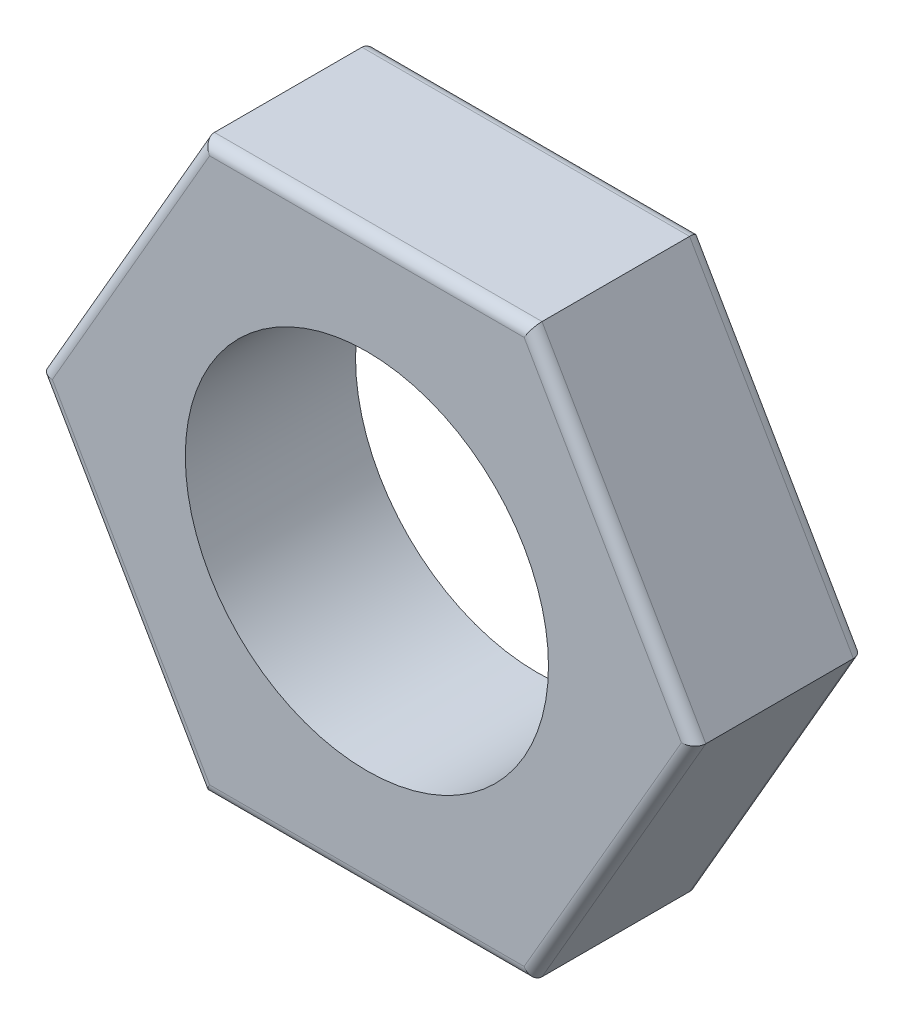
ISO-10303-21;
HEADER;
FILE_DESCRIPTION(('STEP AP214'),'2;1');
FILE_NAME('part.step','',(''),(''),'','','');
FILE_SCHEMA(('AUTOMOTIVE_DESIGN { 1 0 10303 214 1 1 1 1 }'));
ENDSEC;
DATA;
#1=APPLICATION_CONTEXT('core data for automotive mechanical design processes');
#2=APPLICATION_PROTOCOL_DEFINITION('international standard','automotive_design',2000,#1);
#3=PRODUCT_CONTEXT('',#1,'mechanical');
#4=PRODUCT('Part','Part','',(#3));
#5=PRODUCT_RELATED_PRODUCT_CATEGORY('part','',(#4));
#6=PRODUCT_DEFINITION_FORMATION('','',#4);
#7=PRODUCT_DEFINITION_CONTEXT('part definition',#1,'design');
#8=PRODUCT_DEFINITION('design','',#6,#7);
#9=PRODUCT_DEFINITION_SHAPE('','',#8);
#10=(LENGTH_UNIT() NAMED_UNIT(*) SI_UNIT(.MILLI.,.METRE.));
#11=(NAMED_UNIT(*) PLANE_ANGLE_UNIT() SI_UNIT($,.RADIAN.));
#12=(NAMED_UNIT(*) SI_UNIT($,.STERADIAN.) SOLID_ANGLE_UNIT());
#13=UNCERTAINTY_MEASURE_WITH_UNIT(LENGTH_MEASURE(1.E-05),#10,'distance_accuracy_value','');
#14=(GEOMETRIC_REPRESENTATION_CONTEXT(3) GLOBAL_UNCERTAINTY_ASSIGNED_CONTEXT((#13)) GLOBAL_UNIT_ASSIGNED_CONTEXT((#10,
#11,#12)) REPRESENTATION_CONTEXT('',''));
#15=CARTESIAN_POINT('',(0.,0.,0.));
#16=DIRECTION('',(0.,0.,1.));
#17=DIRECTION('',(1.,0.,0.));
#18=AXIS2_PLACEMENT_3D('',#15,#16,#17);
#19=CARTESIAN_POINT('',(-7.21687836487031,-12.5,7.5));
#20=DIRECTION('',(0.,1.,0.));
#21=DIRECTION('',(0.,0.,1.));
#22=AXIS2_PLACEMENT_3D('',#19,#20,#21);
#23=PLANE('',#22);
#24=DIRECTION('',(0.,0.,-1.));
#25=VECTOR('',#24,1.);
#26=CARTESIAN_POINT('',(-7.21687836487031,-12.5,7.5));
#27=LINE('',#26,#25);
#28=CARTESIAN_POINT('',(-7.21687836487031,-12.5,7.));
#29=VERTEX_POINT('',#28);
#30=CARTESIAN_POINT('',(-7.21687836487031,-12.5,0.5));
#31=VERTEX_POINT('',#30);
#32=EDGE_CURVE('E131',#29,#31,#27,.T.);
#33=ORIENTED_EDGE('',*,*,#32,.T.);
#34=DIRECTION('',(1.,0.,0.));
#35=VECTOR('',#34,1.);
#36=CARTESIAN_POINT('',(-7.21687836487031,-12.5,0.5));
#37=LINE('',#36,#35);
#38=CARTESIAN_POINT('',(7.21687836487031,-12.5,0.5));
#39=VERTEX_POINT('',#38);
#40=EDGE_CURVE('E249',#31,#39,#37,.T.);
#41=ORIENTED_EDGE('',*,*,#40,.T.);
#42=DIRECTION('',(0.,0.,-1.));
#43=VECTOR('',#42,1.);
#44=CARTESIAN_POINT('',(7.21687836487031,-12.5,7.5));
#45=LINE('',#44,#43);
#46=CARTESIAN_POINT('',(7.21687836487031,-12.5,7.));
#47=VERTEX_POINT('',#46);
#48=EDGE_CURVE('E153',#47,#39,#45,.T.);
#49=ORIENTED_EDGE('',*,*,#48,.F.);
#50=DIRECTION('',(1.,0.,0.));
#51=VECTOR('',#50,1.);
#52=CARTESIAN_POINT('',(-7.21687836487031,-12.5,7.));
#53=LINE('',#52,#51);
#54=EDGE_CURVE('E247',#47,#29,#53,.F.);
#55=ORIENTED_EDGE('',*,*,#54,.T.);
#56=EDGE_LOOP('',(#33,#41,#49,#55));
#57=FACE_BOUND('',#56,.T.);
#58=ADVANCED_FACE('F34',(#57),#23,.F.);
#59=CARTESIAN_POINT('',(7.21687836487031,-12.5,7.5));
#60=DIRECTION('',(-0.866025403784438,0.5,0.));
#61=DIRECTION('',(-0.5,-0.866025403784439,0.));
#62=AXIS2_PLACEMENT_3D('',#59,#60,#61);
#63=PLANE('',#62);
#64=ORIENTED_EDGE('',*,*,#48,.T.);
#65=DIRECTION('',(0.5,0.866025403784439,0.));
#66=VECTOR('',#65,1.);
#67=CARTESIAN_POINT('',(7.21687836487031,-12.5,0.5));
#68=LINE('',#67,#66);
#69=CARTESIAN_POINT('',(14.4337567297406,0.,0.5));
#70=VERTEX_POINT('',#69);
#71=EDGE_CURVE('E136',#39,#70,#68,.T.);
#72=ORIENTED_EDGE('',*,*,#71,.T.);
#73=DIRECTION('',(0.,0.,-1.));
#74=VECTOR('',#73,1.);
#75=CARTESIAN_POINT('',(14.4337567297406,0.,7.5));
#76=LINE('',#75,#74);
#77=CARTESIAN_POINT('',(14.4337567297406,0.,7.));
#78=VERTEX_POINT('',#77);
#79=EDGE_CURVE('E216',#78,#70,#76,.T.);
#80=ORIENTED_EDGE('',*,*,#79,.F.);
#81=DIRECTION('',(0.5,0.866025403784439,0.));
#82=VECTOR('',#81,1.);
#83=CARTESIAN_POINT('',(7.21687836487031,-12.5,7.));
#84=LINE('',#83,#82);
#85=EDGE_CURVE('E243',#78,#47,#84,.F.);
#86=ORIENTED_EDGE('',*,*,#85,.T.);
#87=EDGE_LOOP('',(#64,#72,#80,#86));
#88=FACE_BOUND('',#87,.T.);
#89=ADVANCED_FACE('F282',(#88),#63,.F.);
#90=CARTESIAN_POINT('',(14.4337567297406,0.,7.5));
#91=DIRECTION('',(-0.866025403784438,-0.5,0.));
#92=DIRECTION('',(0.5,-0.866025403784438,0.));
#93=AXIS2_PLACEMENT_3D('',#90,#91,#92);
#94=PLANE('',#93);
#95=ORIENTED_EDGE('',*,*,#79,.T.);
#96=DIRECTION('',(-0.5,0.866025403784438,0.));
#97=VECTOR('',#96,1.);
#98=CARTESIAN_POINT('',(14.4337567297406,0.,0.5));
#99=LINE('',#98,#97);
#100=CARTESIAN_POINT('',(7.21687836487031,12.5,0.5));
#101=VERTEX_POINT('',#100);
#102=EDGE_CURVE('E241',#70,#101,#99,.T.);
#103=ORIENTED_EDGE('',*,*,#102,.T.);
#104=DIRECTION('',(0.,0.,-1.));
#105=VECTOR('',#104,1.);
#106=CARTESIAN_POINT('',(7.21687836487031,12.5,7.5));
#107=LINE('',#106,#105);
#108=CARTESIAN_POINT('',(7.21687836487031,12.5,7.));
#109=VERTEX_POINT('',#108);
#110=EDGE_CURVE('E213',#109,#101,#107,.T.);
#111=ORIENTED_EDGE('',*,*,#110,.F.);
#112=DIRECTION('',(-0.5,0.866025403784438,0.));
#113=VECTOR('',#112,1.);
#114=CARTESIAN_POINT('',(14.4337567297406,0.,7.));
#115=LINE('',#114,#113);
#116=EDGE_CURVE('E239',#109,#78,#115,.F.);
#117=ORIENTED_EDGE('',*,*,#116,.T.);
#118=EDGE_LOOP('',(#95,#103,#111,#117));
#119=FACE_BOUND('',#118,.T.);
#120=ADVANCED_FACE('F269',(#119),#94,.F.);
#121=CARTESIAN_POINT('',(7.21687836487031,12.5,7.5));
#122=DIRECTION('',(0.,-1.,0.));
#123=DIRECTION('',(0.,0.,-1.));
#124=AXIS2_PLACEMENT_3D('',#121,#122,#123);
#125=PLANE('',#124);
#126=ORIENTED_EDGE('',*,*,#110,.T.);
#127=DIRECTION('',(-1.,0.,0.));
#128=VECTOR('',#127,1.);
#129=CARTESIAN_POINT('',(7.21687836487031,12.5,0.5));
#130=LINE('',#129,#128);
#131=CARTESIAN_POINT('',(-7.21687836487031,12.5,0.5));
#132=VERTEX_POINT('',#131);
#133=EDGE_CURVE('E237',#101,#132,#130,.T.);
#134=ORIENTED_EDGE('',*,*,#133,.T.);
#135=DIRECTION('',(0.,0.,-1.));
#136=VECTOR('',#135,1.);
#137=CARTESIAN_POINT('',(-7.21687836487031,12.5,7.5));
#138=LINE('',#137,#136);
#139=CARTESIAN_POINT('',(-7.21687836487031,12.5,7.));
#140=VERTEX_POINT('',#139);
#141=EDGE_CURVE('E147',#140,#132,#138,.T.);
#142=ORIENTED_EDGE('',*,*,#141,.F.);
#143=DIRECTION('',(-1.,0.,0.));
#144=VECTOR('',#143,1.);
#145=CARTESIAN_POINT('',(7.21687836487031,12.5,7.));
#146=LINE('',#145,#144);
#147=EDGE_CURVE('E235',#140,#109,#146,.F.);
#148=ORIENTED_EDGE('',*,*,#147,.T.);
#149=EDGE_LOOP('',(#126,#134,#142,#148));
#150=FACE_BOUND('',#149,.T.);
#151=ADVANCED_FACE('F266',(#150),#125,.F.);
#152=CARTESIAN_POINT('',(-7.21687836487031,12.5,7.5));
#153=DIRECTION('',(0.866025403784438,-0.5,0.));
#154=DIRECTION('',(0.5,0.866025403784438,0.));
#155=AXIS2_PLACEMENT_3D('',#152,#153,#154);
#156=PLANE('',#155);
#157=ORIENTED_EDGE('',*,*,#141,.T.);
#158=DIRECTION('',(-0.5,-0.866025403784438,0.));
#159=VECTOR('',#158,1.);
#160=CARTESIAN_POINT('',(-7.21687836487031,12.5,0.5));
#161=LINE('',#160,#159);
#162=CARTESIAN_POINT('',(-14.4337567297406,0.,0.5));
#163=VERTEX_POINT('',#162);
#164=EDGE_CURVE('E146',#132,#163,#161,.T.);
#165=ORIENTED_EDGE('',*,*,#164,.T.);
#166=DIRECTION('',(0.,0.,-1.));
#167=VECTOR('',#166,1.);
#168=CARTESIAN_POINT('',(-14.4337567297406,0.,7.5));
#169=LINE('',#168,#167);
#170=CARTESIAN_POINT('',(-14.4337567297406,0.,7.));
#171=VERTEX_POINT('',#170);
#172=EDGE_CURVE('E129',#171,#163,#169,.T.);
#173=ORIENTED_EDGE('',*,*,#172,.F.);
#174=DIRECTION('',(-0.5,-0.866025403784438,0.));
#175=VECTOR('',#174,1.);
#176=CARTESIAN_POINT('',(-7.21687836487031,12.5,7.));
#177=LINE('',#176,#175);
#178=EDGE_CURVE('E143',#171,#140,#177,.F.);
#179=ORIENTED_EDGE('',*,*,#178,.T.);
#180=EDGE_LOOP('',(#157,#165,#173,#179));
#181=FACE_BOUND('',#180,.T.);
#182=ADVANCED_FACE('F142',(#181),#156,.F.);
#183=CARTESIAN_POINT('',(-14.4337567297406,0.,7.5));
#184=DIRECTION('',(0.866025403784438,0.5,0.));
#185=DIRECTION('',(-0.5,0.866025403784439,0.));
#186=AXIS2_PLACEMENT_3D('',#183,#184,#185);
#187=PLANE('',#186);
#188=ORIENTED_EDGE('',*,*,#172,.T.);
#189=DIRECTION('',(0.5,-0.866025403784439,0.));
#190=VECTOR('',#189,1.);
#191=CARTESIAN_POINT('',(-14.4337567297406,0.,0.5));
#192=LINE('',#191,#190);
#193=EDGE_CURVE('E135',#163,#31,#192,.T.);
#194=ORIENTED_EDGE('',*,*,#193,.T.);
#195=ORIENTED_EDGE('',*,*,#32,.F.);
#196=DIRECTION('',(0.5,-0.866025403784439,0.));
#197=VECTOR('',#196,1.);
#198=CARTESIAN_POINT('',(-14.4337567297406,0.,7.));
#199=LINE('',#198,#197);
#200=EDGE_CURVE('E126',#29,#171,#199,.F.);
#201=ORIENTED_EDGE('',*,*,#200,.T.);
#202=EDGE_LOOP('',(#188,#194,#195,#201));
#203=FACE_BOUND('',#202,.T.);
#204=ADVANCED_FACE('F128',(#203),#187,.F.);
#205=CARTESIAN_POINT('',(0.,0.,7.5));
#206=DIRECTION('',(0.,0.,1.));
#207=DIRECTION('',(1.,0.,0.));
#208=AXIS2_PLACEMENT_3D('',#205,#206,#207);
#209=PLANE('',#208);
#210=DIRECTION('',(-0.5,-0.866025403784438,0.));
#211=VECTOR('',#210,1.);
#212=CARTESIAN_POINT('',(-14.0007440278484,-0.249999999999996,7.5));
#213=LINE('',#212,#211);
#214=CARTESIAN_POINT('',(-6.92820323027549,12.,7.5));
#215=VERTEX_POINT('',#214);
#216=CARTESIAN_POINT('',(-13.856406460551,0.,7.5));
#217=VERTEX_POINT('',#216);
#218=EDGE_CURVE('E43',#215,#217,#213,.T.);
#219=ORIENTED_EDGE('',*,*,#218,.T.);
#220=DIRECTION('',(0.5,-0.866025403784439,0.));
#221=VECTOR('',#220,1.);
#222=CARTESIAN_POINT('',(-6.78386566297809,-12.25,7.5));
#223=LINE('',#222,#221);
#224=CARTESIAN_POINT('',(-6.9282032302755,-12.,7.5));
#225=VERTEX_POINT('',#224);
#226=EDGE_CURVE('E11',#217,#225,#223,.T.);
#227=ORIENTED_EDGE('',*,*,#226,.T.);
#228=DIRECTION('',(1.,0.,0.));
#229=VECTOR('',#228,1.);
#230=CARTESIAN_POINT('',(7.21687836487031,-12.,7.5));
#231=LINE('',#230,#229);
#232=CARTESIAN_POINT('',(6.9282032302755,-12.,7.5));
#233=VERTEX_POINT('',#232);
#234=EDGE_CURVE('E257',#225,#233,#231,.T.);
#235=ORIENTED_EDGE('',*,*,#234,.T.);
#236=DIRECTION('',(0.5,0.866025403784439,0.));
#237=VECTOR('',#236,1.);
#238=CARTESIAN_POINT('',(14.0007440278484,0.250000000000005,7.5));
#239=LINE('',#238,#237);
#240=CARTESIAN_POINT('',(13.856406460551,0.,7.5));
#241=VERTEX_POINT('',#240);
#242=EDGE_CURVE('E255',#233,#241,#239,.T.);
#243=ORIENTED_EDGE('',*,*,#242,.T.);
#244=DIRECTION('',(-0.5,0.866025403784438,0.));
#245=VECTOR('',#244,1.);
#246=CARTESIAN_POINT('',(6.78386566297809,12.25,7.5));
#247=LINE('',#246,#245);
#248=CARTESIAN_POINT('',(6.92820323027549,12.,7.5));
#249=VERTEX_POINT('',#248);
#250=EDGE_CURVE('E253',#241,#249,#247,.T.);
#251=ORIENTED_EDGE('',*,*,#250,.T.);
#252=DIRECTION('',(-1.,0.,0.));
#253=VECTOR('',#252,1.);
#254=CARTESIAN_POINT('',(-7.21687836487031,12.,7.5));
#255=LINE('',#254,#253);
#256=EDGE_CURVE('E251',#249,#215,#255,.T.);
#257=ORIENTED_EDGE('',*,*,#256,.T.);
#258=EDGE_LOOP('',(#219,#227,#235,#243,#251,#257));
#259=FACE_BOUND('',#258,.T.);
#260=CARTESIAN_POINT('',(0.,0.,7.5));
#261=DIRECTION('',(0.,0.,1.));
#262=DIRECTION('',(1.,0.,0.));
#263=AXIS2_PLACEMENT_3D('',#260,#261,#262);
#264=CIRCLE('',#263,8.);
#265=CARTESIAN_POINT('',(8.,0.,7.5));
#266=VERTEX_POINT('',#265);
#267=EDGE_CURVE('E198',#266,#266,#264,.T.);
#268=ORIENTED_EDGE('',*,*,#267,.F.);
#269=EDGE_LOOP('',(#268));
#270=FACE_BOUND('',#269,.T.);
#271=ADVANCED_FACE('F258',(#259,#270),#209,.T.);
#272=CARTESIAN_POINT('',(0.,0.,0.));
#273=DIRECTION('',(0.,0.,1.));
#274=DIRECTION('',(1.,0.,0.));
#275=AXIS2_PLACEMENT_3D('',#272,#273,#274);
#276=PLANE('',#275);
#277=DIRECTION('',(0.5,-0.866025403784439,0.));
#278=VECTOR('',#277,1.);
#279=CARTESIAN_POINT('',(-10.3923048454132,-5.99999999999999,0.));
#280=LINE('',#279,#278);
#281=CARTESIAN_POINT('',(-6.92820323027549,-12.,0.));
#282=VERTEX_POINT('',#281);
#283=CARTESIAN_POINT('',(-13.856406460551,0.,0.));
#284=VERTEX_POINT('',#283);
#285=EDGE_CURVE('E224',#282,#284,#280,.F.);
#286=ORIENTED_EDGE('',*,*,#285,.T.);
#287=DIRECTION('',(-0.5,-0.866025403784438,0.));
#288=VECTOR('',#287,1.);
#289=CARTESIAN_POINT('',(-10.3923048454132,5.99999999999999,0.));
#290=LINE('',#289,#288);
#291=CARTESIAN_POINT('',(-6.92820323027549,12.,0.));
#292=VERTEX_POINT('',#291);
#293=EDGE_CURVE('E232',#284,#292,#290,.F.);
#294=ORIENTED_EDGE('',*,*,#293,.T.);
#295=DIRECTION('',(-1.,0.,0.));
#296=VECTOR('',#295,1.);
#297=CARTESIAN_POINT('',(0.,12.,0.));
#298=LINE('',#297,#296);
#299=CARTESIAN_POINT('',(6.92820323027549,12.,0.));
#300=VERTEX_POINT('',#299);
#301=EDGE_CURVE('E230',#292,#300,#298,.F.);
#302=ORIENTED_EDGE('',*,*,#301,.T.);
#303=DIRECTION('',(-0.5,0.866025403784438,0.));
#304=VECTOR('',#303,1.);
#305=CARTESIAN_POINT('',(10.3923048454132,5.99999999999999,0.));
#306=LINE('',#305,#304);
#307=CARTESIAN_POINT('',(13.856406460551,0.,0.));
#308=VERTEX_POINT('',#307);
#309=EDGE_CURVE('E228',#300,#308,#306,.F.);
#310=ORIENTED_EDGE('',*,*,#309,.T.);
#311=DIRECTION('',(0.5,0.866025403784439,0.));
#312=VECTOR('',#311,1.);
#313=CARTESIAN_POINT('',(10.3923048454132,-5.99999999999999,0.));
#314=LINE('',#313,#312);
#315=CARTESIAN_POINT('',(6.92820323027549,-12.,0.));
#316=VERTEX_POINT('',#315);
#317=EDGE_CURVE('E226',#308,#316,#314,.F.);
#318=ORIENTED_EDGE('',*,*,#317,.T.);
#319=DIRECTION('',(1.,0.,0.));
#320=VECTOR('',#319,1.);
#321=CARTESIAN_POINT('',(0.,-12.,0.));
#322=LINE('',#321,#320);
#323=EDGE_CURVE('E222',#316,#282,#322,.F.);
#324=ORIENTED_EDGE('',*,*,#323,.T.);
#325=EDGE_LOOP('',(#286,#294,#302,#310,#318,#324));
#326=FACE_BOUND('',#325,.T.);
#327=CARTESIAN_POINT('',(0.,0.,0.));
#328=DIRECTION('',(0.,0.,1.));
#329=DIRECTION('',(1.,0.,0.));
#330=AXIS2_PLACEMENT_3D('',#327,#328,#329);
#331=CIRCLE('',#330,8.);
#332=CARTESIAN_POINT('',(8.,0.,0.));
#333=VERTEX_POINT('',#332);
#334=EDGE_CURVE('E204',#333,#333,#331,.T.);
#335=ORIENTED_EDGE('',*,*,#334,.T.);
#336=EDGE_LOOP('',(#335));
#337=FACE_BOUND('',#336,.T.);
#338=ADVANCED_FACE('F388',(#326,#337),#276,.F.);
#339=CARTESIAN_POINT('',(0.,0.,0.));
#340=DIRECTION('',(0.,0.,1.));
#341=DIRECTION('',(1.,0.,0.));
#342=AXIS2_PLACEMENT_3D('',#339,#340,#341);
#343=CYLINDRICAL_SURFACE('',#342,8.);
#344=ORIENTED_EDGE('',*,*,#334,.F.);
#345=EDGE_LOOP('',(#344));
#346=FACE_BOUND('',#345,.T.);
#347=ORIENTED_EDGE('',*,*,#267,.T.);
#348=EDGE_LOOP('',(#347));
#349=FACE_BOUND('',#348,.T.);
#350=ADVANCED_FACE('F311',(#346,#349),#343,.F.);
#351=CARTESIAN_POINT('',(6.78386566297809,-12.25,0.5));
#352=DIRECTION('',(0.5,0.866025403784439,0.));
#353=DIRECTION('',(-0.866025403784438,0.5,0.));
#354=AXIS2_PLACEMENT_3D('',#351,#352,#353);
#355=CYLINDRICAL_SURFACE('',#354,0.5);
#356=CARTESIAN_POINT('',(6.92820323027549,-12.,0.5));
#357=DIRECTION('',(0.866025403784439,0.5,0.));
#358=DIRECTION('',(0.5,-0.866025403784439,0.));
#359=AXIS2_PLACEMENT_3D('',#356,#357,#358);
#360=ELLIPSE('',#359,0.577350269189626,0.5);
#361=EDGE_CURVE('E191',#316,#39,#360,.F.);
#362=ORIENTED_EDGE('',*,*,#361,.F.);
#363=ORIENTED_EDGE('',*,*,#317,.F.);
#364=CARTESIAN_POINT('',(13.856406460551,0.,0.5));
#365=DIRECTION('',(0.,1.,0.));
#366=DIRECTION('',(1.,0.,0.));
#367=AXIS2_PLACEMENT_3D('',#364,#365,#366);
#368=ELLIPSE('',#367,0.577350269189626,0.5);
#369=EDGE_CURVE('E160',#70,#308,#368,.T.);
#370=ORIENTED_EDGE('',*,*,#369,.F.);
#371=ORIENTED_EDGE('',*,*,#71,.F.);
#372=EDGE_LOOP('',(#362,#363,#370,#371));
#373=FACE_BOUND('',#372,.T.);
#374=ADVANCED_FACE('F308',(#373),#355,.T.);
#375=CARTESIAN_POINT('',(14.0007440278484,-0.249999999999997,0.5));
#376=DIRECTION('',(-0.5,0.866025403784438,0.));
#377=DIRECTION('',(-0.866025403784438,-0.5,0.));
#378=AXIS2_PLACEMENT_3D('',#375,#376,#377);
#379=CYLINDRICAL_SURFACE('',#378,0.5);
#380=ORIENTED_EDGE('',*,*,#369,.T.);
#381=ORIENTED_EDGE('',*,*,#309,.F.);
#382=CARTESIAN_POINT('',(6.92820323027549,12.,0.5));
#383=DIRECTION('',(-0.866025403784439,0.5,0.));
#384=DIRECTION('',(0.5,0.866025403784439,0.));
#385=AXIS2_PLACEMENT_3D('',#382,#383,#384);
#386=ELLIPSE('',#385,0.577350269189626,0.5);
#387=EDGE_CURVE('E189',#101,#300,#386,.T.);
#388=ORIENTED_EDGE('',*,*,#387,.F.);
#389=ORIENTED_EDGE('',*,*,#102,.F.);
#390=EDGE_LOOP('',(#380,#381,#388,#389));
#391=FACE_BOUND('',#390,.T.);
#392=ADVANCED_FACE('F305',(#391),#379,.T.);
#393=CARTESIAN_POINT('',(-7.21687836487031,-12.,0.5));
#394=DIRECTION('',(1.,0.,0.));
#395=DIRECTION('',(0.,0.,-1.));
#396=AXIS2_PLACEMENT_3D('',#393,#394,#395);
#397=CYLINDRICAL_SURFACE('',#396,0.5);
#398=ORIENTED_EDGE('',*,*,#361,.T.);
#399=ORIENTED_EDGE('',*,*,#40,.F.);
#400=CARTESIAN_POINT('',(-6.92820323027549,-12.,0.5));
#401=DIRECTION('',(0.866025403784439,-0.5,0.));
#402=DIRECTION('',(0.5,0.866025403784439,0.));
#403=AXIS2_PLACEMENT_3D('',#400,#401,#402);
#404=ELLIPSE('',#403,0.577350269189626,0.5);
#405=EDGE_CURVE('E183',#282,#31,#404,.F.);
#406=ORIENTED_EDGE('',*,*,#405,.F.);
#407=ORIENTED_EDGE('',*,*,#323,.F.);
#408=EDGE_LOOP('',(#398,#399,#406,#407));
#409=FACE_BOUND('',#408,.T.);
#410=ADVANCED_FACE('F301',(#409),#397,.T.);
#411=CARTESIAN_POINT('',(7.21687836487031,12.,0.5));
#412=DIRECTION('',(-1.,0.,0.));
#413=DIRECTION('',(0.,0.,1.));
#414=AXIS2_PLACEMENT_3D('',#411,#412,#413);
#415=CYLINDRICAL_SURFACE('',#414,0.5);
#416=ORIENTED_EDGE('',*,*,#387,.T.);
#417=ORIENTED_EDGE('',*,*,#301,.F.);
#418=CARTESIAN_POINT('',(-6.92820323027549,12.,0.5));
#419=DIRECTION('',(-0.866025403784439,-0.5,0.));
#420=DIRECTION('',(-0.5,0.866025403784439,0.));
#421=AXIS2_PLACEMENT_3D('',#418,#419,#420);
#422=ELLIPSE('',#421,0.577350269189626,0.5);
#423=EDGE_CURVE('E177',#132,#292,#422,.T.);
#424=ORIENTED_EDGE('',*,*,#423,.F.);
#425=ORIENTED_EDGE('',*,*,#133,.F.);
#426=EDGE_LOOP('',(#416,#417,#424,#425));
#427=FACE_BOUND('',#426,.T.);
#428=ADVANCED_FACE('F297',(#427),#415,.T.);
#429=CARTESIAN_POINT('',(-14.0007440278484,0.250000000000004,0.5));
#430=DIRECTION('',(0.5,-0.866025403784439,0.));
#431=DIRECTION('',(0.866025403784438,0.5,0.));
#432=AXIS2_PLACEMENT_3D('',#429,#430,#431);
#433=CYLINDRICAL_SURFACE('',#432,0.5);
#434=ORIENTED_EDGE('',*,*,#405,.T.);
#435=ORIENTED_EDGE('',*,*,#193,.F.);
#436=CARTESIAN_POINT('',(-13.856406460551,0.,0.5));
#437=DIRECTION('',(0.,-1.,0.));
#438=DIRECTION('',(1.,0.,0.));
#439=AXIS2_PLACEMENT_3D('',#436,#437,#438);
#440=ELLIPSE('',#439,0.577350269189626,0.5);
#441=EDGE_CURVE('E172',#284,#163,#440,.F.);
#442=ORIENTED_EDGE('',*,*,#441,.F.);
#443=ORIENTED_EDGE('',*,*,#285,.F.);
#444=EDGE_LOOP('',(#434,#435,#442,#443));
#445=FACE_BOUND('',#444,.T.);
#446=ADVANCED_FACE('F294',(#445),#433,.T.);
#447=CARTESIAN_POINT('',(-6.78386566297809,12.25,0.5));
#448=DIRECTION('',(-0.5,-0.866025403784438,0.));
#449=DIRECTION('',(0.866025403784438,-0.5,0.));
#450=AXIS2_PLACEMENT_3D('',#447,#448,#449);
#451=CYLINDRICAL_SURFACE('',#450,0.5);
#452=ORIENTED_EDGE('',*,*,#423,.T.);
#453=ORIENTED_EDGE('',*,*,#293,.F.);
#454=ORIENTED_EDGE('',*,*,#441,.T.);
#455=ORIENTED_EDGE('',*,*,#164,.F.);
#456=EDGE_LOOP('',(#452,#453,#454,#455));
#457=FACE_BOUND('',#456,.T.);
#458=ADVANCED_FACE('F279',(#457),#451,.T.);
#459=CARTESIAN_POINT('',(10.3923048454132,-5.99999999999999,7.));
#460=DIRECTION('',(-0.5,-0.866025403784439,0.));
#461=DIRECTION('',(0.866025403784438,-0.5,0.));
#462=AXIS2_PLACEMENT_3D('',#459,#460,#461);
#463=CYLINDRICAL_SURFACE('',#462,0.5);
#464=CARTESIAN_POINT('',(6.9282032302755,-12.,7.));
#465=DIRECTION('',(-0.866025403784439,-0.5,0.));
#466=DIRECTION('',(0.5,-0.866025403784439,0.));
#467=AXIS2_PLACEMENT_3D('',#464,#465,#466);
#468=ELLIPSE('',#467,0.577350269189626,0.5);
#469=EDGE_CURVE('E166',#47,#233,#468,.T.);
#470=ORIENTED_EDGE('',*,*,#469,.F.);
#471=ORIENTED_EDGE('',*,*,#85,.F.);
#472=CARTESIAN_POINT('',(13.856406460551,0.,7.));
#473=DIRECTION('',(0.,-1.,0.));
#474=DIRECTION('',(1.,0.,0.));
#475=AXIS2_PLACEMENT_3D('',#472,#473,#474);
#476=ELLIPSE('',#475,0.577350269189626,0.5);
#477=EDGE_CURVE('E38',#241,#78,#476,.F.);
#478=ORIENTED_EDGE('',*,*,#477,.F.);
#479=ORIENTED_EDGE('',*,*,#242,.F.);
#480=EDGE_LOOP('',(#470,#471,#478,#479));
#481=FACE_BOUND('',#480,.T.);
#482=ADVANCED_FACE('F36',(#481),#463,.T.);
#483=CARTESIAN_POINT('',(10.3923048454132,5.99999999999999,7.));
#484=DIRECTION('',(0.5,-0.866025403784438,0.));
#485=DIRECTION('',(0.866025403784438,0.5,0.));
#486=AXIS2_PLACEMENT_3D('',#483,#484,#485);
#487=CYLINDRICAL_SURFACE('',#486,0.5);
#488=ORIENTED_EDGE('',*,*,#477,.T.);
#489=ORIENTED_EDGE('',*,*,#116,.F.);
#490=CARTESIAN_POINT('',(6.9282032302755,12.,7.));
#491=DIRECTION('',(0.866025403784439,-0.5,0.));
#492=DIRECTION('',(0.5,0.866025403784439,0.));
#493=AXIS2_PLACEMENT_3D('',#490,#491,#492);
#494=ELLIPSE('',#493,0.577350269189626,0.5);
#495=EDGE_CURVE('E164',#249,#109,#494,.F.);
#496=ORIENTED_EDGE('',*,*,#495,.F.);
#497=ORIENTED_EDGE('',*,*,#250,.F.);
#498=EDGE_LOOP('',(#488,#489,#496,#497));
#499=FACE_BOUND('',#498,.T.);
#500=ADVANCED_FACE('F271',(#499),#487,.T.);
#501=CARTESIAN_POINT('',(0.,-12.,7.));
#502=DIRECTION('',(-1.,0.,0.));
#503=DIRECTION('',(0.,0.,1.));
#504=AXIS2_PLACEMENT_3D('',#501,#502,#503);
#505=CYLINDRICAL_SURFACE('',#504,0.5);
#506=ORIENTED_EDGE('',*,*,#469,.T.);
#507=ORIENTED_EDGE('',*,*,#234,.F.);
#508=CARTESIAN_POINT('',(-6.9282032302755,-12.,7.));
#509=DIRECTION('',(-0.866025403784439,0.5,0.));
#510=DIRECTION('',(0.5,0.866025403784439,0.));
#511=AXIS2_PLACEMENT_3D('',#508,#509,#510);
#512=ELLIPSE('',#511,0.577350269189626,0.5);
#513=EDGE_CURVE('E157',#29,#225,#512,.T.);
#514=ORIENTED_EDGE('',*,*,#513,.F.);
#515=ORIENTED_EDGE('',*,*,#54,.F.);
#516=EDGE_LOOP('',(#506,#507,#514,#515));
#517=FACE_BOUND('',#516,.T.);
#518=ADVANCED_FACE('F273',(#517),#505,.T.);
#519=CARTESIAN_POINT('',(0.,12.,7.));
#520=DIRECTION('',(1.,0.,0.));
#521=DIRECTION('',(0.,0.,-1.));
#522=AXIS2_PLACEMENT_3D('',#519,#520,#521);
#523=CYLINDRICAL_SURFACE('',#522,0.5);
#524=ORIENTED_EDGE('',*,*,#495,.T.);
#525=ORIENTED_EDGE('',*,*,#147,.F.);
#526=CARTESIAN_POINT('',(-6.9282032302755,12.,7.));
#527=DIRECTION('',(0.866025403784439,0.5,0.));
#528=DIRECTION('',(0.5,-0.866025403784439,0.));
#529=AXIS2_PLACEMENT_3D('',#526,#527,#528);
#530=ELLIPSE('',#529,0.577350269189626,0.5);
#531=EDGE_CURVE('E151',#215,#140,#530,.F.);
#532=ORIENTED_EDGE('',*,*,#531,.F.);
#533=ORIENTED_EDGE('',*,*,#256,.F.);
#534=EDGE_LOOP('',(#524,#525,#532,#533));
#535=FACE_BOUND('',#534,.T.);
#536=ADVANCED_FACE('F263',(#535),#523,.T.);
#537=CARTESIAN_POINT('',(-10.3923048454132,-5.99999999999999,7.));
#538=DIRECTION('',(-0.5,0.866025403784439,0.));
#539=DIRECTION('',(-0.866025403784438,-0.5,0.));
#540=AXIS2_PLACEMENT_3D('',#537,#538,#539);
#541=CYLINDRICAL_SURFACE('',#540,0.5);
#542=ORIENTED_EDGE('',*,*,#513,.T.);
#543=ORIENTED_EDGE('',*,*,#226,.F.);
#544=CARTESIAN_POINT('',(-13.856406460551,0.,7.));
#545=DIRECTION('',(0.,1.,0.));
#546=DIRECTION('',(-1.,0.,0.));
#547=AXIS2_PLACEMENT_3D('',#544,#545,#546);
#548=ELLIPSE('',#547,0.577350269189626,0.5);
#549=EDGE_CURVE('E51',#171,#217,#548,.T.);
#550=ORIENTED_EDGE('',*,*,#549,.F.);
#551=ORIENTED_EDGE('',*,*,#200,.F.);
#552=EDGE_LOOP('',(#542,#543,#550,#551));
#553=FACE_BOUND('',#552,.T.);
#554=ADVANCED_FACE('F155',(#553),#541,.T.);
#555=CARTESIAN_POINT('',(-10.3923048454132,5.99999999999999,7.));
#556=DIRECTION('',(0.5,0.866025403784438,0.));
#557=DIRECTION('',(-0.866025403784438,0.5,0.));
#558=AXIS2_PLACEMENT_3D('',#555,#556,#557);
#559=CYLINDRICAL_SURFACE('',#558,0.5);
#560=ORIENTED_EDGE('',*,*,#531,.T.);
#561=ORIENTED_EDGE('',*,*,#178,.F.);
#562=ORIENTED_EDGE('',*,*,#549,.T.);
#563=ORIENTED_EDGE('',*,*,#218,.F.);
#564=EDGE_LOOP('',(#560,#561,#562,#563));
#565=FACE_BOUND('',#564,.T.);
#566=ADVANCED_FACE('F149',(#565),#559,.T.);
#567=CLOSED_SHELL('',(#58,#89,#120,#151,#182,#204,#271,#338,#350,#374,#392,#410,#428,#446,#458,
#482,#500,#518,#536,#554,#566));
#568=MANIFOLD_SOLID_BREP('B2',#567);
#569=ADVANCED_BREP_SHAPE_REPRESENTATION('',(#18,#568),#14);
#570=SHAPE_DEFINITION_REPRESENTATION(#9,#569);
ENDSEC;
END-ISO-10303-21;
